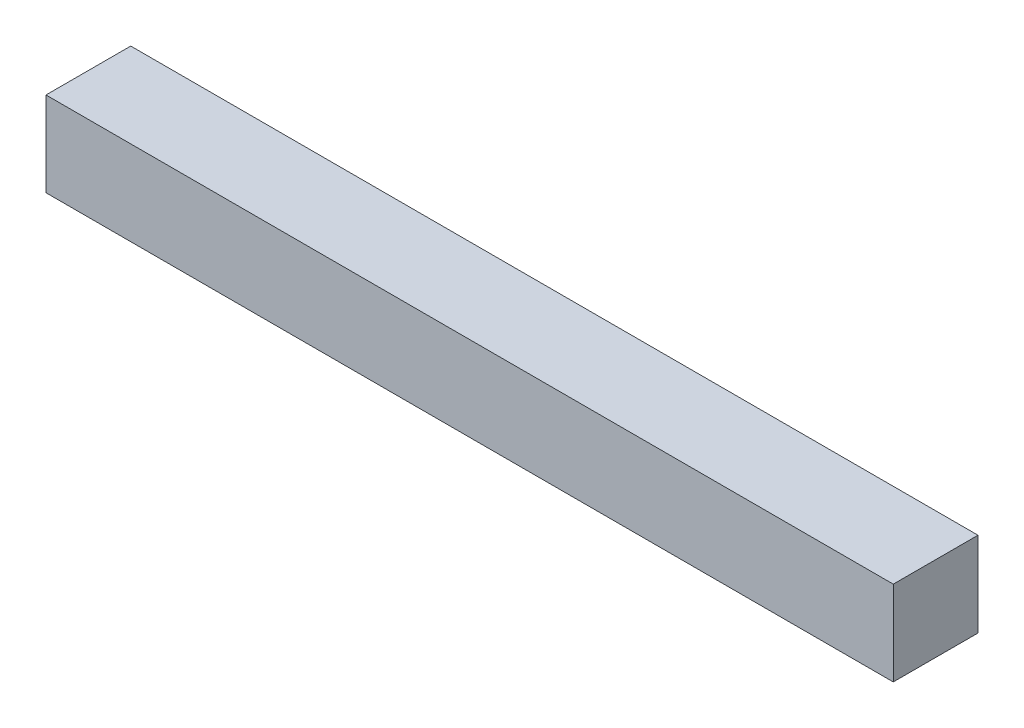
ISO-10303-21;
HEADER;
FILE_DESCRIPTION(('STEP AP214'),'2;1');
FILE_NAME('part.step','',(''),(''),'','','');
FILE_SCHEMA(('AUTOMOTIVE_DESIGN { 1 0 10303 214 1 1 1 1 }'));
ENDSEC;
DATA;
#1=APPLICATION_CONTEXT('core data for automotive mechanical design processes');
#2=APPLICATION_PROTOCOL_DEFINITION('international standard','automotive_design',2000,#1);
#3=PRODUCT_CONTEXT('',#1,'mechanical');
#4=PRODUCT('Part','Part','',(#3));
#5=PRODUCT_RELATED_PRODUCT_CATEGORY('part','',(#4));
#6=PRODUCT_DEFINITION_FORMATION('','',#4);
#7=PRODUCT_DEFINITION_CONTEXT('part definition',#1,'design');
#8=PRODUCT_DEFINITION('design','',#6,#7);
#9=PRODUCT_DEFINITION_SHAPE('','',#8);
#10=(LENGTH_UNIT() NAMED_UNIT(*) SI_UNIT(.MILLI.,.METRE.));
#11=(NAMED_UNIT(*) PLANE_ANGLE_UNIT() SI_UNIT($,.RADIAN.));
#12=(NAMED_UNIT(*) SI_UNIT($,.STERADIAN.) SOLID_ANGLE_UNIT());
#13=UNCERTAINTY_MEASURE_WITH_UNIT(LENGTH_MEASURE(1.E-05),#10,'distance_accuracy_value','');
#14=(GEOMETRIC_REPRESENTATION_CONTEXT(3) GLOBAL_UNCERTAINTY_ASSIGNED_CONTEXT((#13)) GLOBAL_UNIT_ASSIGNED_CONTEXT((#10,
#11,#12)) REPRESENTATION_CONTEXT('',''));
#15=CARTESIAN_POINT('',(0.,0.,0.));
#16=DIRECTION('',(0.,0.,1.));
#17=DIRECTION('',(1.,0.,0.));
#18=AXIS2_PLACEMENT_3D('',#15,#16,#17);
#19=CARTESIAN_POINT('',(0.,-3.04771133363467,1.));
#20=DIRECTION('',(1.,0.,0.));
#21=DIRECTION('',(0.,0.,-1.));
#22=AXIS2_PLACEMENT_3D('',#19,#20,#21);
#23=PLANE('',#22);
#24=DIRECTION('',(0.,-1.,0.));
#25=VECTOR('',#24,1.);
#26=CARTESIAN_POINT('',(0.,-3.04771133363467,0.));
#27=LINE('',#26,#25);
#28=CARTESIAN_POINT('',(0.,-2.04771133363467,0.));
#29=VERTEX_POINT('',#28);
#30=CARTESIAN_POINT('',(0.,-3.04771133363467,0.));
#31=VERTEX_POINT('',#30);
#32=EDGE_CURVE('E100',#29,#31,#27,.T.);
#33=ORIENTED_EDGE('',*,*,#32,.T.);
#34=DIRECTION('',(0.,0.,-1.));
#35=VECTOR('',#34,1.);
#36=CARTESIAN_POINT('',(0.,-3.04771133363467,1.));
#37=LINE('',#36,#35);
#38=CARTESIAN_POINT('',(0.,-3.04771133363467,1.));
#39=VERTEX_POINT('',#38);
#40=EDGE_CURVE('E11',#39,#31,#37,.T.);
#41=ORIENTED_EDGE('',*,*,#40,.F.);
#42=DIRECTION('',(0.,-1.,0.));
#43=VECTOR('',#42,1.);
#44=CARTESIAN_POINT('',(0.,-3.04771133363467,1.));
#45=LINE('',#44,#43);
#46=CARTESIAN_POINT('',(0.,-2.04771133363467,1.));
#47=VERTEX_POINT('',#46);
#48=EDGE_CURVE('E88',#47,#39,#45,.T.);
#49=ORIENTED_EDGE('',*,*,#48,.F.);
#50=DIRECTION('',(0.,0.,-1.));
#51=VECTOR('',#50,1.);
#52=CARTESIAN_POINT('',(0.,-2.04771133363467,1.));
#53=LINE('',#52,#51);
#54=EDGE_CURVE('E96',#47,#29,#53,.T.);
#55=ORIENTED_EDGE('',*,*,#54,.T.);
#56=EDGE_LOOP('',(#33,#41,#49,#55));
#57=FACE_BOUND('',#56,.T.);
#58=ADVANCED_FACE('F37',(#57),#23,.F.);
#59=CARTESIAN_POINT('',(0.,-3.04771133363467,1.));
#60=DIRECTION('',(0.,1.,0.));
#61=DIRECTION('',(0.,0.,1.));
#62=AXIS2_PLACEMENT_3D('',#59,#60,#61);
#63=PLANE('',#62);
#64=DIRECTION('',(1.,0.,0.));
#65=VECTOR('',#64,1.);
#66=CARTESIAN_POINT('',(0.,-3.04771133363467,0.));
#67=LINE('',#66,#65);
#68=CARTESIAN_POINT('',(10.,-3.04771133363467,0.));
#69=VERTEX_POINT('',#68);
#70=EDGE_CURVE('E92',#31,#69,#67,.T.);
#71=ORIENTED_EDGE('',*,*,#70,.T.);
#72=DIRECTION('',(0.,0.,-1.));
#73=VECTOR('',#72,1.);
#74=CARTESIAN_POINT('',(10.,-3.04771133363467,1.));
#75=LINE('',#74,#73);
#76=CARTESIAN_POINT('',(10.,-3.04771133363467,1.));
#77=VERTEX_POINT('',#76);
#78=EDGE_CURVE('E45',#77,#69,#75,.T.);
#79=ORIENTED_EDGE('',*,*,#78,.F.);
#80=DIRECTION('',(1.,0.,0.));
#81=VECTOR('',#80,1.);
#82=CARTESIAN_POINT('',(0.,-3.04771133363467,1.));
#83=LINE('',#82,#81);
#84=EDGE_CURVE('E83',#39,#77,#83,.T.);
#85=ORIENTED_EDGE('',*,*,#84,.F.);
#86=ORIENTED_EDGE('',*,*,#40,.T.);
#87=EDGE_LOOP('',(#71,#79,#85,#86));
#88=FACE_BOUND('',#87,.T.);
#89=ADVANCED_FACE('F91',(#88),#63,.F.);
#90=CARTESIAN_POINT('',(10.,-3.04771133363467,1.));
#91=DIRECTION('',(-1.,0.,0.));
#92=DIRECTION('',(0.,0.,1.));
#93=AXIS2_PLACEMENT_3D('',#90,#91,#92);
#94=PLANE('',#93);
#95=DIRECTION('',(0.,1.,0.));
#96=VECTOR('',#95,1.);
#97=CARTESIAN_POINT('',(10.,-3.04771133363467,0.));
#98=LINE('',#97,#96);
#99=CARTESIAN_POINT('',(10.,-2.04771133363467,0.));
#100=VERTEX_POINT('',#99);
#101=EDGE_CURVE('E70',#69,#100,#98,.T.);
#102=ORIENTED_EDGE('',*,*,#101,.T.);
#103=DIRECTION('',(0.,0.,-1.));
#104=VECTOR('',#103,1.);
#105=CARTESIAN_POINT('',(10.,-2.04771133363467,1.));
#106=LINE('',#105,#104);
#107=CARTESIAN_POINT('',(10.,-2.04771133363467,1.));
#108=VERTEX_POINT('',#107);
#109=EDGE_CURVE('E93',#108,#100,#106,.T.);
#110=ORIENTED_EDGE('',*,*,#109,.F.);
#111=DIRECTION('',(0.,1.,0.));
#112=VECTOR('',#111,1.);
#113=CARTESIAN_POINT('',(10.,-3.04771133363467,1.));
#114=LINE('',#113,#112);
#115=EDGE_CURVE('E86',#77,#108,#114,.T.);
#116=ORIENTED_EDGE('',*,*,#115,.F.);
#117=ORIENTED_EDGE('',*,*,#78,.T.);
#118=EDGE_LOOP('',(#102,#110,#116,#117));
#119=FACE_BOUND('',#118,.T.);
#120=ADVANCED_FACE('F94',(#119),#94,.F.);
#121=CARTESIAN_POINT('',(0.,-2.04771133363467,1.));
#122=DIRECTION('',(0.,-1.,0.));
#123=DIRECTION('',(0.,0.,-1.));
#124=AXIS2_PLACEMENT_3D('',#121,#122,#123);
#125=PLANE('',#124);
#126=DIRECTION('',(-1.,0.,0.));
#127=VECTOR('',#126,1.);
#128=CARTESIAN_POINT('',(0.,-2.04771133363467,0.));
#129=LINE('',#128,#127);
#130=EDGE_CURVE('E76',#100,#29,#129,.T.);
#131=ORIENTED_EDGE('',*,*,#130,.T.);
#132=ORIENTED_EDGE('',*,*,#54,.F.);
#133=DIRECTION('',(-1.,0.,0.));
#134=VECTOR('',#133,1.);
#135=CARTESIAN_POINT('',(0.,-2.04771133363467,1.));
#136=LINE('',#135,#134);
#137=EDGE_CURVE('E53',#108,#47,#136,.T.);
#138=ORIENTED_EDGE('',*,*,#137,.F.);
#139=ORIENTED_EDGE('',*,*,#109,.T.);
#140=EDGE_LOOP('',(#131,#132,#138,#139));
#141=FACE_BOUND('',#140,.T.);
#142=ADVANCED_FACE('F107',(#141),#125,.F.);
#143=CARTESIAN_POINT('',(0.,-2.04771133363467,1.));
#144=DIRECTION('',(0.,0.,-1.));
#145=DIRECTION('',(-1.,0.,0.));
#146=AXIS2_PLACEMENT_3D('',#143,#144,#145);
#147=PLANE('',#146);
#148=ORIENTED_EDGE('',*,*,#48,.T.);
#149=ORIENTED_EDGE('',*,*,#84,.T.);
#150=ORIENTED_EDGE('',*,*,#115,.T.);
#151=ORIENTED_EDGE('',*,*,#137,.T.);
#152=EDGE_LOOP('',(#148,#149,#150,#151));
#153=FACE_BOUND('',#152,.T.);
#154=ADVANCED_FACE('F84',(#153),#147,.F.);
#155=CARTESIAN_POINT('',(0.,-2.04771133363467,0.));
#156=DIRECTION('',(0.,0.,-1.));
#157=DIRECTION('',(-1.,0.,0.));
#158=AXIS2_PLACEMENT_3D('',#155,#156,#157);
#159=PLANE('',#158);
#160=ORIENTED_EDGE('',*,*,#32,.F.);
#161=ORIENTED_EDGE('',*,*,#130,.F.);
#162=ORIENTED_EDGE('',*,*,#101,.F.);
#163=ORIENTED_EDGE('',*,*,#70,.F.);
#164=EDGE_LOOP('',(#160,#161,#162,#163));
#165=FACE_BOUND('',#164,.T.);
#166=ADVANCED_FACE('F110',(#165),#159,.T.);
#167=CLOSED_SHELL('',(#58,#89,#120,#142,#154,#166));
#168=MANIFOLD_SOLID_BREP('B2',#167);
#169=ADVANCED_BREP_SHAPE_REPRESENTATION('',(#18,#168),#14);
#170=SHAPE_DEFINITION_REPRESENTATION(#9,#169);
ENDSEC;
END-ISO-10303-21;
